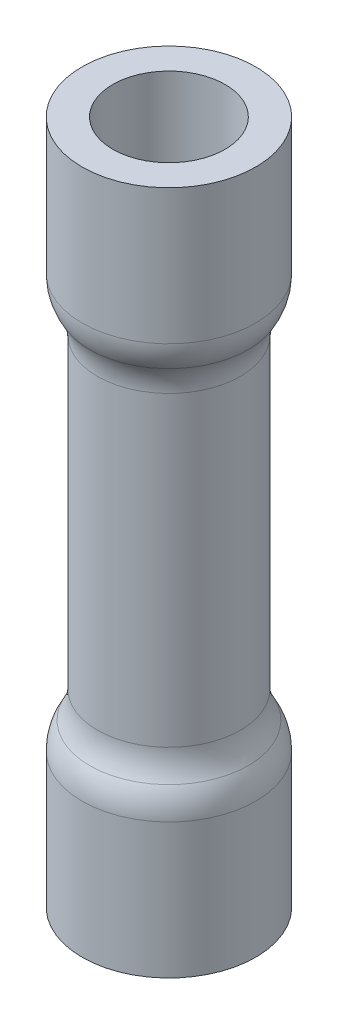
ISO-10303-21;
HEADER;
FILE_DESCRIPTION(('STEP AP214'),'2;1');
FILE_NAME('part.step','',(''),(''),'','','');
FILE_SCHEMA(('AUTOMOTIVE_DESIGN { 1 0 10303 214 1 1 1 1 }'));
ENDSEC;
DATA;
#1=APPLICATION_CONTEXT('core data for automotive mechanical design processes');
#2=APPLICATION_PROTOCOL_DEFINITION('international standard','automotive_design',2000,#1);
#3=PRODUCT_CONTEXT('',#1,'mechanical');
#4=PRODUCT('Part','Part','',(#3));
#5=PRODUCT_RELATED_PRODUCT_CATEGORY('part','',(#4));
#6=PRODUCT_DEFINITION_FORMATION('','',#4);
#7=PRODUCT_DEFINITION_CONTEXT('part definition',#1,'design');
#8=PRODUCT_DEFINITION('design','',#6,#7);
#9=PRODUCT_DEFINITION_SHAPE('','',#8);
#10=(LENGTH_UNIT() NAMED_UNIT(*) SI_UNIT(.MILLI.,.METRE.));
#11=(NAMED_UNIT(*) PLANE_ANGLE_UNIT() SI_UNIT($,.RADIAN.));
#12=(NAMED_UNIT(*) SI_UNIT($,.STERADIAN.) SOLID_ANGLE_UNIT());
#13=UNCERTAINTY_MEASURE_WITH_UNIT(LENGTH_MEASURE(1.E-05),#10,'distance_accuracy_value','');
#14=(GEOMETRIC_REPRESENTATION_CONTEXT(3) GLOBAL_UNCERTAINTY_ASSIGNED_CONTEXT((#13)) GLOBAL_UNIT_ASSIGNED_CONTEXT((#10,
#11,#12)) REPRESENTATION_CONTEXT('',''));
#15=CARTESIAN_POINT('',(0.,0.,0.));
#16=DIRECTION('',(0.,0.,1.));
#17=DIRECTION('',(1.,0.,0.));
#18=AXIS2_PLACEMENT_3D('',#15,#16,#17);
#19=CARTESIAN_POINT('',(0.,17.018,0.));
#20=DIRECTION('',(0.,1.,0.));
#21=DIRECTION('',(0.,0.,1.));
#22=AXIS2_PLACEMENT_3D('',#19,#20,#21);
#23=CYLINDRICAL_SURFACE('',#22,2.159);
#24=CARTESIAN_POINT('',(0.,17.018,0.));
#25=DIRECTION('',(0.,1.,0.));
#26=DIRECTION('',(0.,0.,1.));
#27=AXIS2_PLACEMENT_3D('',#24,#25,#26);
#28=CIRCLE('',#27,2.159);
#29=CARTESIAN_POINT('',(0.,17.018,2.159));
#30=VERTEX_POINT('',#29);
#31=EDGE_CURVE('E10',#30,#30,#28,.T.);
#32=ORIENTED_EDGE('',*,*,#31,.F.);
#33=EDGE_LOOP('',(#32));
#34=FACE_BOUND('',#33,.T.);
#35=CARTESIAN_POINT('',(0.,13.6570280266123,0.));
#36=DIRECTION('',(0.,1.,0.));
#37=DIRECTION('',(0.,0.,1.));
#38=AXIS2_PLACEMENT_3D('',#35,#36,#37);
#39=CIRCLE('',#38,2.159);
#40=CARTESIAN_POINT('',(0.,13.6570280266123,2.159));
#41=VERTEX_POINT('',#40);
#42=EDGE_CURVE('E83',#41,#41,#39,.T.);
#43=ORIENTED_EDGE('',*,*,#42,.T.);
#44=EDGE_LOOP('',(#43));
#45=FACE_BOUND('',#44,.T.);
#46=ADVANCED_FACE('F31',(#34,#45),#23,.T.);
#47=CARTESIAN_POINT('',(1.397,17.018,0.));
#48=DIRECTION('',(0.,1.,0.));
#49=DIRECTION('',(0.,0.,1.));
#50=AXIS2_PLACEMENT_3D('',#47,#48,#49);
#51=PLANE('',#50);
#52=ORIENTED_EDGE('',*,*,#31,.T.);
#53=EDGE_LOOP('',(#52));
#54=FACE_BOUND('',#53,.T.);
#55=CARTESIAN_POINT('',(0.,17.018,0.));
#56=DIRECTION('',(0.,1.,0.));
#57=DIRECTION('',(0.,0.,1.));
#58=AXIS2_PLACEMENT_3D('',#55,#56,#57);
#59=CIRCLE('',#58,1.397);
#60=CARTESIAN_POINT('',(0.,17.018,1.397));
#61=VERTEX_POINT('',#60);
#62=EDGE_CURVE('E37',#61,#61,#59,.T.);
#63=ORIENTED_EDGE('',*,*,#62,.F.);
#64=EDGE_LOOP('',(#63));
#65=FACE_BOUND('',#64,.T.);
#66=ADVANCED_FACE('F136',(#54,#65),#51,.T.);
#67=CARTESIAN_POINT('',(0.,17.018,0.));
#68=DIRECTION('',(0.,1.,0.));
#69=DIRECTION('',(0.,0.,1.));
#70=AXIS2_PLACEMENT_3D('',#67,#68,#69);
#71=CYLINDRICAL_SURFACE('',#70,1.397);
#72=ORIENTED_EDGE('',*,*,#62,.T.);
#73=EDGE_LOOP('',(#72));
#74=FACE_BOUND('',#73,.T.);
#75=CARTESIAN_POINT('',(0.,13.6570280266123,0.));
#76=DIRECTION('',(0.,1.,0.));
#77=DIRECTION('',(0.,0.,1.));
#78=AXIS2_PLACEMENT_3D('',#75,#76,#77);
#79=CIRCLE('',#78,1.397);
#80=CARTESIAN_POINT('',(0.,13.6570280266123,1.397));
#81=VERTEX_POINT('',#80);
#82=EDGE_CURVE('E41',#81,#81,#79,.T.);
#83=ORIENTED_EDGE('',*,*,#82,.F.);
#84=EDGE_LOOP('',(#83));
#85=FACE_BOUND('',#84,.T.);
#86=ADVANCED_FACE('F141',(#74,#85),#71,.F.);
#87=CARTESIAN_POINT('',(0.,13.6570280266123,0.));
#88=DIRECTION('',(0.,1.,0.));
#89=DIRECTION('',(0.,0.,1.));
#90=AXIS2_PLACEMENT_3D('',#87,#88,#89);
#91=TOROIDAL_SURFACE('',#90,0.888999999999999,0.508);
#92=ORIENTED_EDGE('',*,*,#82,.T.);
#93=EDGE_LOOP('',(#92));
#94=FACE_BOUND('',#93,.T.);
#95=CARTESIAN_POINT('',(0.,13.3894224212898,0.));
#96=DIRECTION('',(0.,1.,0.));
#97=DIRECTION('',(0.,0.,1.));
#98=AXIS2_PLACEMENT_3D('',#95,#96,#97);
#99=CIRCLE('',#98,1.3208);
#100=CARTESIAN_POINT('',(0.,13.3894224212898,1.3208));
#101=VERTEX_POINT('',#100);
#102=EDGE_CURVE('E45',#101,#101,#99,.T.);
#103=ORIENTED_EDGE('',*,*,#102,.F.);
#104=EDGE_LOOP('',(#103));
#105=FACE_BOUND('',#104,.T.);
#106=ADVANCED_FACE('F145',(#94,#105),#91,.F.);
#107=CARTESIAN_POINT('',(0.,12.319,0.));
#108=DIRECTION('',(0.,1.,0.));
#109=DIRECTION('',(0.,0.,1.));
#110=AXIS2_PLACEMENT_3D('',#107,#108,#109);
#111=TOROIDAL_SURFACE('',#110,3.048,2.032);
#112=ORIENTED_EDGE('',*,*,#102,.T.);
#113=EDGE_LOOP('',(#112));
#114=FACE_BOUND('',#113,.T.);
#115=CARTESIAN_POINT('',(0.,12.319,0.));
#116=DIRECTION('',(0.,1.,0.));
#117=DIRECTION('',(0.,0.,1.));
#118=AXIS2_PLACEMENT_3D('',#115,#116,#117);
#119=CIRCLE('',#118,1.016);
#120=CARTESIAN_POINT('',(0.,12.319,1.016));
#121=VERTEX_POINT('',#120);
#122=EDGE_CURVE('E50',#121,#121,#119,.T.);
#123=ORIENTED_EDGE('',*,*,#122,.F.);
#124=EDGE_LOOP('',(#123));
#125=FACE_BOUND('',#124,.T.);
#126=ADVANCED_FACE('F151',(#114,#125),#111,.T.);
#127=CARTESIAN_POINT('',(0.,17.018,0.));
#128=DIRECTION('',(0.,1.,0.));
#129=DIRECTION('',(0.,0.,1.));
#130=AXIS2_PLACEMENT_3D('',#127,#128,#129);
#131=CYLINDRICAL_SURFACE('',#130,1.016);
#132=ORIENTED_EDGE('',*,*,#122,.T.);
#133=EDGE_LOOP('',(#132));
#134=FACE_BOUND('',#133,.T.);
#135=CARTESIAN_POINT('',(0.,4.699,0.));
#136=DIRECTION('',(0.,1.,0.));
#137=DIRECTION('',(0.,0.,1.));
#138=AXIS2_PLACEMENT_3D('',#135,#136,#137);
#139=CIRCLE('',#138,1.016);
#140=CARTESIAN_POINT('',(0.,4.699,1.016));
#141=VERTEX_POINT('',#140);
#142=EDGE_CURVE('E53',#141,#141,#139,.T.);
#143=ORIENTED_EDGE('',*,*,#142,.F.);
#144=EDGE_LOOP('',(#143));
#145=FACE_BOUND('',#144,.T.);
#146=ADVANCED_FACE('F155',(#134,#145),#131,.F.);
#147=CARTESIAN_POINT('',(0.,4.699,0.));
#148=DIRECTION('',(0.,1.,0.));
#149=DIRECTION('',(0.,0.,1.));
#150=AXIS2_PLACEMENT_3D('',#147,#148,#149);
#151=TOROIDAL_SURFACE('',#150,3.048,2.032);
#152=ORIENTED_EDGE('',*,*,#142,.T.);
#153=EDGE_LOOP('',(#152));
#154=FACE_BOUND('',#153,.T.);
#155=CARTESIAN_POINT('',(0.,3.62857757871017,0.));
#156=DIRECTION('',(0.,1.,0.));
#157=DIRECTION('',(0.,0.,1.));
#158=AXIS2_PLACEMENT_3D('',#155,#156,#157);
#159=CIRCLE('',#158,1.3208);
#160=CARTESIAN_POINT('',(0.,3.62857757871017,1.3208));
#161=VERTEX_POINT('',#160);
#162=EDGE_CURVE('E56',#161,#161,#159,.T.);
#163=ORIENTED_EDGE('',*,*,#162,.F.);
#164=EDGE_LOOP('',(#163));
#165=FACE_BOUND('',#164,.T.);
#166=ADVANCED_FACE('F159',(#154,#165),#151,.T.);
#167=CARTESIAN_POINT('',(0.,3.36097197338771,0.));
#168=DIRECTION('',(0.,1.,0.));
#169=DIRECTION('',(0.,0.,1.));
#170=AXIS2_PLACEMENT_3D('',#167,#168,#169);
#171=TOROIDAL_SURFACE('',#170,0.888999999999999,0.508000000000001);
#172=ORIENTED_EDGE('',*,*,#162,.T.);
#173=EDGE_LOOP('',(#172));
#174=FACE_BOUND('',#173,.T.);
#175=CARTESIAN_POINT('',(0.,3.36097197338771,0.));
#176=DIRECTION('',(0.,1.,0.));
#177=DIRECTION('',(0.,0.,1.));
#178=AXIS2_PLACEMENT_3D('',#175,#176,#177);
#179=CIRCLE('',#178,1.397);
#180=CARTESIAN_POINT('',(0.,3.36097197338771,1.397));
#181=VERTEX_POINT('',#180);
#182=EDGE_CURVE('E59',#181,#181,#179,.T.);
#183=ORIENTED_EDGE('',*,*,#182,.F.);
#184=EDGE_LOOP('',(#183));
#185=FACE_BOUND('',#184,.T.);
#186=ADVANCED_FACE('F132',(#174,#185),#171,.F.);
#187=CARTESIAN_POINT('',(0.,17.018,0.));
#188=DIRECTION('',(0.,1.,0.));
#189=DIRECTION('',(0.,0.,1.));
#190=AXIS2_PLACEMENT_3D('',#187,#188,#189);
#191=CYLINDRICAL_SURFACE('',#190,1.397);
#192=ORIENTED_EDGE('',*,*,#182,.T.);
#193=EDGE_LOOP('',(#192));
#194=FACE_BOUND('',#193,.T.);
#195=CARTESIAN_POINT('',(0.,0.,0.));
#196=DIRECTION('',(0.,1.,0.));
#197=DIRECTION('',(0.,0.,1.));
#198=AXIS2_PLACEMENT_3D('',#195,#196,#197);
#199=CIRCLE('',#198,1.397);
#200=CARTESIAN_POINT('',(0.,0.,1.397));
#201=VERTEX_POINT('',#200);
#202=EDGE_CURVE('E62',#201,#201,#199,.T.);
#203=ORIENTED_EDGE('',*,*,#202,.F.);
#204=EDGE_LOOP('',(#203));
#205=FACE_BOUND('',#204,.T.);
#206=ADVANCED_FACE('F126',(#194,#205),#191,.F.);
#207=CARTESIAN_POINT('',(2.159,0.,0.));
#208=DIRECTION('',(0.,-1.,0.));
#209=DIRECTION('',(0.,0.,-1.));
#210=AXIS2_PLACEMENT_3D('',#207,#208,#209);
#211=PLANE('',#210);
#212=ORIENTED_EDGE('',*,*,#202,.T.);
#213=EDGE_LOOP('',(#212));
#214=FACE_BOUND('',#213,.T.);
#215=CARTESIAN_POINT('',(0.,0.,0.));
#216=DIRECTION('',(0.,1.,0.));
#217=DIRECTION('',(0.,0.,1.));
#218=AXIS2_PLACEMENT_3D('',#215,#216,#217);
#219=CIRCLE('',#218,2.159);
#220=CARTESIAN_POINT('',(0.,0.,2.159));
#221=VERTEX_POINT('',#220);
#222=EDGE_CURVE('E65',#221,#221,#219,.T.);
#223=ORIENTED_EDGE('',*,*,#222,.F.);
#224=EDGE_LOOP('',(#223));
#225=FACE_BOUND('',#224,.T.);
#226=ADVANCED_FACE('F121',(#214,#225),#211,.T.);
#227=CARTESIAN_POINT('',(0.,17.018,0.));
#228=DIRECTION('',(0.,1.,0.));
#229=DIRECTION('',(0.,0.,1.));
#230=AXIS2_PLACEMENT_3D('',#227,#228,#229);
#231=CYLINDRICAL_SURFACE('',#230,2.159);
#232=CARTESIAN_POINT('',(0.,3.36097197338771,0.));
#233=DIRECTION('',(0.,1.,0.));
#234=DIRECTION('',(0.,0.,1.));
#235=AXIS2_PLACEMENT_3D('',#232,#233,#234);
#236=CIRCLE('',#235,2.159);
#237=CARTESIAN_POINT('',(0.,3.36097197338771,2.159));
#238=VERTEX_POINT('',#237);
#239=EDGE_CURVE('E68',#238,#238,#236,.T.);
#240=ORIENTED_EDGE('',*,*,#239,.F.);
#241=EDGE_LOOP('',(#240));
#242=FACE_BOUND('',#241,.T.);
#243=ORIENTED_EDGE('',*,*,#222,.T.);
#244=EDGE_LOOP('',(#243));
#245=FACE_BOUND('',#244,.T.);
#246=ADVANCED_FACE('F115',(#242,#245),#231,.T.);
#247=CARTESIAN_POINT('',(0.,3.36097197338771,0.));
#248=DIRECTION('',(0.,1.,0.));
#249=DIRECTION('',(0.,0.,1.));
#250=AXIS2_PLACEMENT_3D('',#247,#248,#249);
#251=DEGENERATE_TOROIDAL_SURFACE('',#250,0.888999999999999,1.27,.T.);
#252=CARTESIAN_POINT('',(0.,4.02998598669385,0.));
#253=DIRECTION('',(0.,1.,0.));
#254=DIRECTION('',(0.,0.,1.));
#255=AXIS2_PLACEMENT_3D('',#252,#253,#254);
#256=CIRCLE('',#255,1.9685);
#257=CARTESIAN_POINT('',(0.,4.02998598669385,1.9685));
#258=VERTEX_POINT('',#257);
#259=EDGE_CURVE('E71',#258,#258,#256,.T.);
#260=ORIENTED_EDGE('',*,*,#259,.F.);
#261=EDGE_LOOP('',(#260));
#262=FACE_BOUND('',#261,.T.);
#263=ORIENTED_EDGE('',*,*,#239,.T.);
#264=EDGE_LOOP('',(#263));
#265=FACE_BOUND('',#264,.T.);
#266=ADVANCED_FACE('F109',(#262,#265),#251,.T.);
#267=CARTESIAN_POINT('',(0.,4.699,0.));
#268=DIRECTION('',(0.,1.,0.));
#269=DIRECTION('',(0.,0.,1.));
#270=AXIS2_PLACEMENT_3D('',#267,#268,#269);
#271=TOROIDAL_SURFACE('',#270,3.048,1.27);
#272=CARTESIAN_POINT('',(0.,4.699,0.));
#273=DIRECTION('',(0.,1.,0.));
#274=DIRECTION('',(0.,0.,1.));
#275=AXIS2_PLACEMENT_3D('',#272,#273,#274);
#276=CIRCLE('',#275,1.778);
#277=CARTESIAN_POINT('',(0.,4.699,1.778));
#278=VERTEX_POINT('',#277);
#279=EDGE_CURVE('E74',#278,#278,#276,.T.);
#280=ORIENTED_EDGE('',*,*,#279,.F.);
#281=EDGE_LOOP('',(#280));
#282=FACE_BOUND('',#281,.T.);
#283=ORIENTED_EDGE('',*,*,#259,.T.);
#284=EDGE_LOOP('',(#283));
#285=FACE_BOUND('',#284,.T.);
#286=ADVANCED_FACE('F103',(#282,#285),#271,.F.);
#287=CARTESIAN_POINT('',(0.,17.018,0.));
#288=DIRECTION('',(0.,1.,0.));
#289=DIRECTION('',(0.,0.,1.));
#290=AXIS2_PLACEMENT_3D('',#287,#288,#289);
#291=CYLINDRICAL_SURFACE('',#290,1.778);
#292=CARTESIAN_POINT('',(0.,12.319,0.));
#293=DIRECTION('',(0.,1.,0.));
#294=DIRECTION('',(0.,0.,1.));
#295=AXIS2_PLACEMENT_3D('',#292,#293,#294);
#296=CIRCLE('',#295,1.778);
#297=CARTESIAN_POINT('',(0.,12.319,1.778));
#298=VERTEX_POINT('',#297);
#299=EDGE_CURVE('E77',#298,#298,#296,.T.);
#300=ORIENTED_EDGE('',*,*,#299,.F.);
#301=EDGE_LOOP('',(#300));
#302=FACE_BOUND('',#301,.T.);
#303=ORIENTED_EDGE('',*,*,#279,.T.);
#304=EDGE_LOOP('',(#303));
#305=FACE_BOUND('',#304,.T.);
#306=ADVANCED_FACE('F97',(#302,#305),#291,.T.);
#307=CARTESIAN_POINT('',(0.,12.319,0.));
#308=DIRECTION('',(0.,1.,0.));
#309=DIRECTION('',(0.,0.,1.));
#310=AXIS2_PLACEMENT_3D('',#307,#308,#309);
#311=TOROIDAL_SURFACE('',#310,3.048,1.27);
#312=CARTESIAN_POINT('',(0.,12.9880140133061,0.));
#313=DIRECTION('',(0.,1.,0.));
#314=DIRECTION('',(0.,0.,1.));
#315=AXIS2_PLACEMENT_3D('',#312,#313,#314);
#316=CIRCLE('',#315,1.9685);
#317=CARTESIAN_POINT('',(0.,12.9880140133061,1.9685));
#318=VERTEX_POINT('',#317);
#319=EDGE_CURVE('E80',#318,#318,#316,.T.);
#320=ORIENTED_EDGE('',*,*,#319,.F.);
#321=EDGE_LOOP('',(#320));
#322=FACE_BOUND('',#321,.T.);
#323=ORIENTED_EDGE('',*,*,#299,.T.);
#324=EDGE_LOOP('',(#323));
#325=FACE_BOUND('',#324,.T.);
#326=ADVANCED_FACE('F91',(#322,#325),#311,.F.);
#327=CARTESIAN_POINT('',(0.,13.6570280266123,0.));
#328=DIRECTION('',(0.,1.,0.));
#329=DIRECTION('',(0.,0.,1.));
#330=AXIS2_PLACEMENT_3D('',#327,#328,#329);
#331=DEGENERATE_TOROIDAL_SURFACE('',#330,0.888999999999999,1.27,.T.);
#332=ORIENTED_EDGE('',*,*,#42,.F.);
#333=EDGE_LOOP('',(#332));
#334=FACE_BOUND('',#333,.T.);
#335=ORIENTED_EDGE('',*,*,#319,.T.);
#336=EDGE_LOOP('',(#335));
#337=FACE_BOUND('',#336,.T.);
#338=ADVANCED_FACE('F88',(#334,#337),#331,.T.);
#339=CLOSED_SHELL('',(#46,#66,#86,#106,#126,#146,#166,#186,#206,#226,#246,#266,#286,#306,#326,#338));
#340=MANIFOLD_SOLID_BREP('B2',#339);
#341=ADVANCED_BREP_SHAPE_REPRESENTATION('',(#18,#340),#14);
#342=SHAPE_DEFINITION_REPRESENTATION(#9,#341);
ENDSEC;
END-ISO-10303-21;
